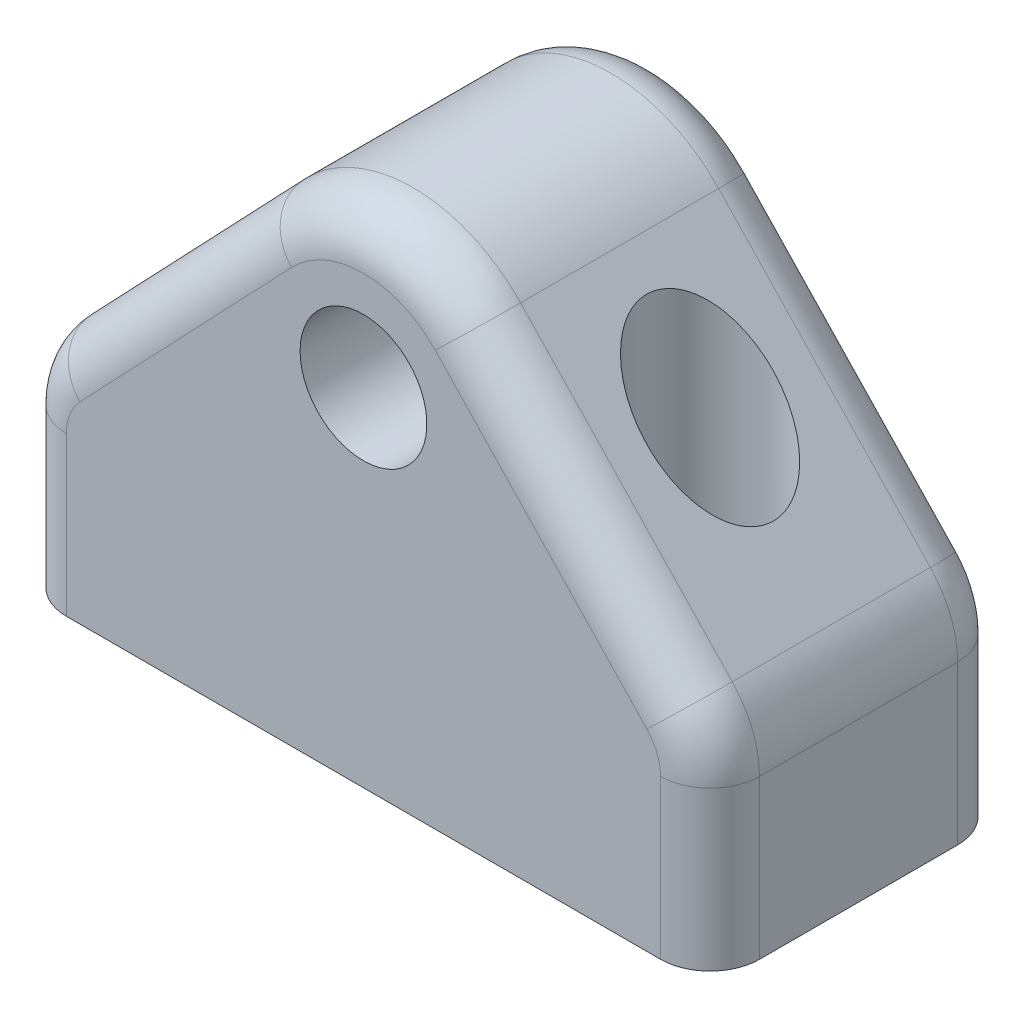
ISO-10303-21;
HEADER;
FILE_DESCRIPTION(('STEP AP214'),'2;1');
FILE_NAME('part.step','',(''),(''),'','','');
FILE_SCHEMA(('AUTOMOTIVE_DESIGN { 1 0 10303 214 1 1 1 1 }'));
ENDSEC;
DATA;
#1=APPLICATION_CONTEXT('core data for automotive mechanical design processes');
#2=APPLICATION_PROTOCOL_DEFINITION('international standard','automotive_design',2000,#1);
#3=PRODUCT_CONTEXT('',#1,'mechanical');
#4=PRODUCT('Part','Part','',(#3));
#5=PRODUCT_RELATED_PRODUCT_CATEGORY('part','',(#4));
#6=PRODUCT_DEFINITION_FORMATION('','',#4);
#7=PRODUCT_DEFINITION_CONTEXT('part definition',#1,'design');
#8=PRODUCT_DEFINITION('design','',#6,#7);
#9=PRODUCT_DEFINITION_SHAPE('','',#8);
#10=(LENGTH_UNIT() NAMED_UNIT(*) SI_UNIT(.MILLI.,.METRE.));
#11=(NAMED_UNIT(*) PLANE_ANGLE_UNIT() SI_UNIT($,.RADIAN.));
#12=(NAMED_UNIT(*) SI_UNIT($,.STERADIAN.) SOLID_ANGLE_UNIT());
#13=UNCERTAINTY_MEASURE_WITH_UNIT(LENGTH_MEASURE(1.E-05),#10,'distance_accuracy_value','');
#14=(GEOMETRIC_REPRESENTATION_CONTEXT(3) GLOBAL_UNCERTAINTY_ASSIGNED_CONTEXT((#13)) GLOBAL_UNIT_ASSIGNED_CONTEXT((#10,
#11,#12)) REPRESENTATION_CONTEXT('',''));
#15=CARTESIAN_POINT('',(0.,0.,0.));
#16=DIRECTION('',(0.,0.,1.));
#17=DIRECTION('',(1.,0.,0.));
#18=AXIS2_PLACEMENT_3D('',#15,#16,#17);
#19=CARTESIAN_POINT('',(3.175,5.08,9.525));
#20=DIRECTION('',(0.,0.,-1.));
#21=DIRECTION('',(-1.,0.,0.));
#22=AXIS2_PLACEMENT_3D('',#19,#20,#21);
#23=PLANE('',#22);
#24=DIRECTION('',(1.,0.,0.));
#25=VECTOR('',#24,1.);
#26=CARTESIAN_POINT('',(22.225,0.,9.525));
#27=LINE('',#26,#25);
#28=CARTESIAN_POINT('',(1.5875,0.,9.525));
#29=VERTEX_POINT('',#28);
#30=CARTESIAN_POINT('',(20.6375,0.,9.525));
#31=VERTEX_POINT('',#30);
#32=EDGE_CURVE('E277',#29,#31,#27,.T.);
#33=ORIENTED_EDGE('',*,*,#32,.T.);
#34=DIRECTION('',(0.,1.,0.));
#35=VECTOR('',#34,1.);
#36=CARTESIAN_POINT('',(20.6375,5.08,9.525));
#37=LINE('',#36,#35);
#38=CARTESIAN_POINT('',(20.6375,5.08,9.525));
#39=VERTEX_POINT('',#38);
#40=EDGE_CURVE('E390',#31,#39,#37,.T.);
#41=ORIENTED_EDGE('',*,*,#40,.T.);
#42=CARTESIAN_POINT('',(19.05,5.08,9.525));
#43=DIRECTION('',(0.,0.,-1.));
#44=DIRECTION('',(-1.,0.,0.));
#45=AXIS2_PLACEMENT_3D('',#42,#43,#44);
#46=CIRCLE('',#45,1.5875);
#47=CARTESIAN_POINT('',(20.1995689655172,6.1748275862069,9.525));
#48=VERTEX_POINT('',#47);
#49=EDGE_CURVE('E70',#39,#48,#46,.F.);
#50=ORIENTED_EDGE('',*,*,#49,.T.);
#51=DIRECTION('',(-0.689655172413793,0.724137931034483,0.));
#52=VECTOR('',#51,1.);
#53=CARTESIAN_POINT('',(12.6490338882283,14.1028894173603,9.525));
#54=LINE('',#53,#52);
#55=CARTESIAN_POINT('',(13.4116379310345,13.3021551724138,9.525));
#56=VERTEX_POINT('',#55);
#57=EDGE_CURVE('E385',#48,#56,#54,.T.);
#58=ORIENTED_EDGE('',*,*,#57,.T.);
#59=CARTESIAN_POINT('',(11.1125,11.1125,9.525));
#60=DIRECTION('',(0.,0.,-1.));
#61=DIRECTION('',(-1.,0.,0.));
#62=AXIS2_PLACEMENT_3D('',#59,#60,#61);
#63=CIRCLE('',#62,3.175);
#64=CARTESIAN_POINT('',(8.81336206896552,13.3021551724138,9.525));
#65=VERTEX_POINT('',#64);
#66=EDGE_CURVE('E373',#56,#65,#63,.F.);
#67=ORIENTED_EDGE('',*,*,#66,.T.);
#68=DIRECTION('',(-0.689655172413793,-0.724137931034483,0.));
#69=VECTOR('',#68,1.);
#70=CARTESIAN_POINT('',(2.02543103448276,6.1748275862069,9.525));
#71=LINE('',#70,#69);
#72=CARTESIAN_POINT('',(2.02543103448276,6.1748275862069,9.525));
#73=VERTEX_POINT('',#72);
#74=EDGE_CURVE('E376',#65,#73,#71,.T.);
#75=ORIENTED_EDGE('',*,*,#74,.T.);
#76=CARTESIAN_POINT('',(3.175,5.08,9.525));
#77=DIRECTION('',(0.,0.,-1.));
#78=DIRECTION('',(-1.,0.,0.));
#79=AXIS2_PLACEMENT_3D('',#76,#77,#78);
#80=CIRCLE('',#79,1.5875);
#81=CARTESIAN_POINT('',(1.5875,5.08,9.525));
#82=VERTEX_POINT('',#81);
#83=EDGE_CURVE('E379',#73,#82,#80,.F.);
#84=ORIENTED_EDGE('',*,*,#83,.T.);
#85=DIRECTION('',(0.,-1.,0.));
#86=VECTOR('',#85,1.);
#87=CARTESIAN_POINT('',(1.5875,5.08,9.525));
#88=LINE('',#87,#86);
#89=EDGE_CURVE('E382',#82,#29,#88,.T.);
#90=ORIENTED_EDGE('',*,*,#89,.T.);
#91=EDGE_LOOP('',(#33,#41,#50,#58,#67,#75,#84,#90));
#92=FACE_BOUND('',#91,.T.);
#93=CARTESIAN_POINT('',(11.1125,11.1125,9.525));
#94=DIRECTION('',(0.,0.,1.));
#95=DIRECTION('',(1.,0.,0.));
#96=AXIS2_PLACEMENT_3D('',#93,#94,#95);
#97=CIRCLE('',#96,2.032);
#98=CARTESIAN_POINT('',(9.0805,11.1125,9.525));
#99=VERTEX_POINT('',#98);
#100=EDGE_CURVE('E267',#99,#99,#97,.T.);
#101=ORIENTED_EDGE('',*,*,#100,.F.);
#102=EDGE_LOOP('',(#101));
#103=FACE_BOUND('',#102,.T.);
#104=ADVANCED_FACE('F45',(#92,#103),#23,.F.);
#105=CARTESIAN_POINT('',(3.175,5.08,0.));
#106=DIRECTION('',(0.,0.,-1.));
#107=DIRECTION('',(-1.,0.,0.));
#108=AXIS2_PLACEMENT_3D('',#105,#106,#107);
#109=PLANE('',#108);
#110=CARTESIAN_POINT('',(19.05,5.08,0.));
#111=DIRECTION('',(0.,0.,-1.));
#112=DIRECTION('',(-1.,0.,0.));
#113=AXIS2_PLACEMENT_3D('',#110,#111,#112);
#114=CIRCLE('',#113,1.5875);
#115=CARTESIAN_POINT('',(20.1995689655172,6.1748275862069,0.));
#116=VERTEX_POINT('',#115);
#117=CARTESIAN_POINT('',(20.6375,5.08,0.));
#118=VERTEX_POINT('',#117);
#119=EDGE_CURVE('E331',#116,#118,#114,.T.);
#120=ORIENTED_EDGE('',*,*,#119,.T.);
#121=DIRECTION('',(0.,1.,0.));
#122=VECTOR('',#121,1.);
#123=CARTESIAN_POINT('',(20.6375,0.,0.));
#124=LINE('',#123,#122);
#125=CARTESIAN_POINT('',(20.6375,0.,0.));
#126=VERTEX_POINT('',#125);
#127=EDGE_CURVE('E334',#118,#126,#124,.F.);
#128=ORIENTED_EDGE('',*,*,#127,.T.);
#129=DIRECTION('',(1.,0.,0.));
#130=VECTOR('',#129,1.);
#131=CARTESIAN_POINT('',(22.225,0.,0.));
#132=LINE('',#131,#130);
#133=CARTESIAN_POINT('',(1.5875,0.,0.));
#134=VERTEX_POINT('',#133);
#135=EDGE_CURVE('E271',#134,#126,#132,.T.);
#136=ORIENTED_EDGE('',*,*,#135,.F.);
#137=DIRECTION('',(0.,-1.,0.));
#138=VECTOR('',#137,1.);
#139=CARTESIAN_POINT('',(1.5875,5.08,0.));
#140=LINE('',#139,#138);
#141=CARTESIAN_POINT('',(1.5875,5.08,0.));
#142=VERTEX_POINT('',#141);
#143=EDGE_CURVE('E325',#134,#142,#140,.F.);
#144=ORIENTED_EDGE('',*,*,#143,.T.);
#145=CARTESIAN_POINT('',(3.175,5.08,0.));
#146=DIRECTION('',(0.,0.,-1.));
#147=DIRECTION('',(-1.,0.,0.));
#148=AXIS2_PLACEMENT_3D('',#145,#146,#147);
#149=CIRCLE('',#148,1.5875);
#150=CARTESIAN_POINT('',(2.02543103448276,6.1748275862069,0.));
#151=VERTEX_POINT('',#150);
#152=EDGE_CURVE('E322',#142,#151,#149,.T.);
#153=ORIENTED_EDGE('',*,*,#152,.T.);
#154=DIRECTION('',(-0.689655172413793,-0.724137931034483,0.));
#155=VECTOR('',#154,1.);
#156=CARTESIAN_POINT('',(8.81336206896552,13.3021551724138,0.));
#157=LINE('',#156,#155);
#158=CARTESIAN_POINT('',(8.81336206896552,13.3021551724138,0.));
#159=VERTEX_POINT('',#158);
#160=EDGE_CURVE('E319',#151,#159,#157,.F.);
#161=ORIENTED_EDGE('',*,*,#160,.T.);
#162=CARTESIAN_POINT('',(11.1125,11.1125,0.));
#163=DIRECTION('',(0.,0.,-1.));
#164=DIRECTION('',(-1.,0.,0.));
#165=AXIS2_PLACEMENT_3D('',#162,#163,#164);
#166=CIRCLE('',#165,3.175);
#167=CARTESIAN_POINT('',(13.4116379310345,13.3021551724138,0.));
#168=VERTEX_POINT('',#167);
#169=EDGE_CURVE('E316',#159,#168,#166,.T.);
#170=ORIENTED_EDGE('',*,*,#169,.T.);
#171=DIRECTION('',(-0.689655172413793,0.724137931034483,0.));
#172=VECTOR('',#171,1.);
#173=CARTESIAN_POINT('',(20.1995689655172,6.1748275862069,0.));
#174=LINE('',#173,#172);
#175=EDGE_CURVE('E328',#168,#116,#174,.F.);
#176=ORIENTED_EDGE('',*,*,#175,.T.);
#177=EDGE_LOOP('',(#120,#128,#136,#144,#153,#161,#170,#176));
#178=FACE_BOUND('',#177,.T.);
#179=CARTESIAN_POINT('',(11.1125,11.1125,0.));
#180=DIRECTION('',(0.,0.,1.));
#181=DIRECTION('',(1.,0.,0.));
#182=AXIS2_PLACEMENT_3D('',#179,#180,#181);
#183=CIRCLE('',#182,2.032);
#184=CARTESIAN_POINT('',(9.0805,11.1125,0.));
#185=VERTEX_POINT('',#184);
#186=EDGE_CURVE('E272',#185,#185,#183,.T.);
#187=ORIENTED_EDGE('',*,*,#186,.T.);
#188=EDGE_LOOP('',(#187));
#189=FACE_BOUND('',#188,.T.);
#190=ADVANCED_FACE('F436',(#178,#189),#109,.T.);
#191=CARTESIAN_POINT('',(22.225,0.,9.525));
#192=DIRECTION('',(0.,1.,0.));
#193=DIRECTION('',(0.,0.,1.));
#194=AXIS2_PLACEMENT_3D('',#191,#192,#193);
#195=PLANE('',#194);
#196=CARTESIAN_POINT('',(4.7625,0.,4.7625));
#197=DIRECTION('',(0.,-1.,0.));
#198=DIRECTION('',(0.,0.,-1.));
#199=AXIS2_PLACEMENT_3D('',#196,#197,#198);
#200=CIRCLE('',#199,2.032);
#201=CARTESIAN_POINT('',(4.7625,0.,2.7305));
#202=VERTEX_POINT('',#201);
#203=EDGE_CURVE('E258',#202,#202,#200,.T.);
#204=ORIENTED_EDGE('',*,*,#203,.F.);
#205=EDGE_LOOP('',(#204));
#206=FACE_BOUND('',#205,.T.);
#207=CARTESIAN_POINT('',(17.4625,0.,4.7625));
#208=DIRECTION('',(0.,-1.,0.));
#209=DIRECTION('',(0.,0.,-1.));
#210=AXIS2_PLACEMENT_3D('',#207,#208,#209);
#211=CIRCLE('',#210,2.032);
#212=CARTESIAN_POINT('',(17.4625,0.,2.7305));
#213=VERTEX_POINT('',#212);
#214=EDGE_CURVE('E251',#213,#213,#211,.T.);
#215=ORIENTED_EDGE('',*,*,#214,.F.);
#216=EDGE_LOOP('',(#215));
#217=FACE_BOUND('',#216,.T.);
#218=ORIENTED_EDGE('',*,*,#135,.T.);
#219=CARTESIAN_POINT('',(20.6375,0.,1.5875));
#220=DIRECTION('',(0.,1.,0.));
#221=DIRECTION('',(0.,0.,1.));
#222=AXIS2_PLACEMENT_3D('',#219,#220,#221);
#223=CIRCLE('',#222,1.5875);
#224=CARTESIAN_POINT('',(22.225,0.,1.5875));
#225=VERTEX_POINT('',#224);
#226=EDGE_CURVE('E174',#126,#225,#223,.F.);
#227=ORIENTED_EDGE('',*,*,#226,.T.);
#228=DIRECTION('',(0.,0.,-1.));
#229=VECTOR('',#228,1.);
#230=CARTESIAN_POINT('',(22.225,0.,9.525));
#231=LINE('',#230,#229);
#232=CARTESIAN_POINT('',(22.225,0.,7.9375));
#233=VERTEX_POINT('',#232);
#234=EDGE_CURVE('E185',#233,#225,#231,.T.);
#235=ORIENTED_EDGE('',*,*,#234,.F.);
#236=CARTESIAN_POINT('',(20.6375,0.,7.9375));
#237=DIRECTION('',(0.,1.,0.));
#238=DIRECTION('',(0.,0.,1.));
#239=AXIS2_PLACEMENT_3D('',#236,#237,#238);
#240=CIRCLE('',#239,1.5875);
#241=EDGE_CURVE('E189',#233,#31,#240,.F.);
#242=ORIENTED_EDGE('',*,*,#241,.T.);
#243=ORIENTED_EDGE('',*,*,#32,.F.);
#244=CARTESIAN_POINT('',(1.5875,0.,7.9375));
#245=DIRECTION('',(0.,1.,0.));
#246=DIRECTION('',(0.,0.,1.));
#247=AXIS2_PLACEMENT_3D('',#244,#245,#246);
#248=CIRCLE('',#247,1.5875);
#249=CARTESIAN_POINT('',(0.,0.,7.9375));
#250=VERTEX_POINT('',#249);
#251=EDGE_CURVE('E337',#29,#250,#248,.F.);
#252=ORIENTED_EDGE('',*,*,#251,.T.);
#253=DIRECTION('',(0.,0.,-1.));
#254=VECTOR('',#253,1.);
#255=CARTESIAN_POINT('',(0.,0.,9.525));
#256=LINE('',#255,#254);
#257=CARTESIAN_POINT('',(0.,0.,1.5875));
#258=VERTEX_POINT('',#257);
#259=EDGE_CURVE('E281',#250,#258,#256,.T.);
#260=ORIENTED_EDGE('',*,*,#259,.T.);
#261=CARTESIAN_POINT('',(1.5875,0.,1.5875));
#262=DIRECTION('',(0.,1.,0.));
#263=DIRECTION('',(0.,0.,1.));
#264=AXIS2_PLACEMENT_3D('',#261,#262,#263);
#265=CIRCLE('',#264,1.5875);
#266=EDGE_CURVE('E342',#258,#134,#265,.F.);
#267=ORIENTED_EDGE('',*,*,#266,.T.);
#268=EDGE_LOOP('',(#218,#227,#235,#242,#243,#252,#260,#267));
#269=FACE_BOUND('',#268,.T.);
#270=ADVANCED_FACE('F424',(#206,#217,#269),#195,.F.);
#271=CARTESIAN_POINT('',(22.225,5.08,9.525));
#272=DIRECTION('',(-1.,0.,0.));
#273=DIRECTION('',(0.,0.,1.));
#274=AXIS2_PLACEMENT_3D('',#271,#272,#273);
#275=PLANE('',#274);
#276=ORIENTED_EDGE('',*,*,#234,.T.);
#277=DIRECTION('',(0.,1.,0.));
#278=VECTOR('',#277,1.);
#279=CARTESIAN_POINT('',(22.225,5.08,1.5875));
#280=LINE('',#279,#278);
#281=CARTESIAN_POINT('',(22.225,5.08,1.5875));
#282=VERTEX_POINT('',#281);
#283=EDGE_CURVE('E183',#225,#282,#280,.T.);
#284=ORIENTED_EDGE('',*,*,#283,.T.);
#285=DIRECTION('',(0.,0.,-1.));
#286=VECTOR('',#285,1.);
#287=CARTESIAN_POINT('',(22.225,5.08,9.525));
#288=LINE('',#287,#286);
#289=CARTESIAN_POINT('',(22.225,5.08,7.9375));
#290=VERTEX_POINT('',#289);
#291=EDGE_CURVE('E166',#290,#282,#288,.T.);
#292=ORIENTED_EDGE('',*,*,#291,.F.);
#293=DIRECTION('',(0.,1.,0.));
#294=VECTOR('',#293,1.);
#295=CARTESIAN_POINT('',(22.225,5.08,7.9375));
#296=LINE('',#295,#294);
#297=EDGE_CURVE('E180',#290,#233,#296,.F.);
#298=ORIENTED_EDGE('',*,*,#297,.T.);
#299=EDGE_LOOP('',(#276,#284,#292,#298));
#300=FACE_BOUND('',#299,.T.);
#301=ADVANCED_FACE('F179',(#300),#275,.F.);
#302=CARTESIAN_POINT('',(19.05,5.08,9.525));
#303=DIRECTION('',(0.,0.,-1.));
#304=DIRECTION('',(-1.,0.,0.));
#305=AXIS2_PLACEMENT_3D('',#302,#303,#304);
#306=CYLINDRICAL_SURFACE('',#305,3.175);
#307=ORIENTED_EDGE('',*,*,#291,.T.);
#308=CARTESIAN_POINT('',(19.05,5.08,1.5875));
#309=DIRECTION('',(0.,0.,-1.));
#310=DIRECTION('',(-1.,0.,0.));
#311=AXIS2_PLACEMENT_3D('',#308,#309,#310);
#312=CIRCLE('',#311,3.175);
#313=CARTESIAN_POINT('',(21.3491379310345,7.26965517241379,1.5875));
#314=VERTEX_POINT('',#313);
#315=EDGE_CURVE('E173',#282,#314,#312,.F.);
#316=ORIENTED_EDGE('',*,*,#315,.T.);
#317=DIRECTION('',(0.,0.,-1.));
#318=VECTOR('',#317,1.);
#319=CARTESIAN_POINT('',(21.3491379310345,7.26965517241379,9.525));
#320=LINE('',#319,#318);
#321=CARTESIAN_POINT('',(21.3491379310345,7.26965517241379,7.9375));
#322=VERTEX_POINT('',#321);
#323=EDGE_CURVE('E168',#322,#314,#320,.T.);
#324=ORIENTED_EDGE('',*,*,#323,.F.);
#325=CARTESIAN_POINT('',(19.05,5.08,7.9375));
#326=DIRECTION('',(0.,0.,-1.));
#327=DIRECTION('',(-1.,0.,0.));
#328=AXIS2_PLACEMENT_3D('',#325,#326,#327);
#329=CIRCLE('',#328,3.175);
#330=EDGE_CURVE('E163',#322,#290,#329,.T.);
#331=ORIENTED_EDGE('',*,*,#330,.T.);
#332=EDGE_LOOP('',(#307,#316,#324,#331));
#333=FACE_BOUND('',#332,.T.);
#334=ADVANCED_FACE('F165',(#333),#306,.T.);
#335=CARTESIAN_POINT('',(14.5612068965517,14.3969827586207,9.525));
#336=DIRECTION('',(-0.724137931034483,-0.689655172413793,0.));
#337=DIRECTION('',(0.689655172413793,-0.724137931034483,0.));
#338=AXIS2_PLACEMENT_3D('',#335,#336,#337);
#339=PLANE('',#338);
#340=CARTESIAN_POINT('',(17.4625,11.350625,4.7625));
#341=DIRECTION('',(-0.724137931034483,-0.689655172413793,0.));
#342=DIRECTION('',(0.689655172413793,-0.724137931034483,0.));
#343=AXIS2_PLACEMENT_3D('',#340,#341,#342);
#344=ELLIPSE('',#343,2.9464,2.032);
#345=CARTESIAN_POINT('',(19.4945,9.217025,4.7625));
#346=VERTEX_POINT('',#345);
#347=EDGE_CURVE('E276',#346,#346,#344,.T.);
#348=ORIENTED_EDGE('',*,*,#347,.T.);
#349=EDGE_LOOP('',(#348));
#350=FACE_BOUND('',#349,.T.);
#351=ORIENTED_EDGE('',*,*,#323,.T.);
#352=DIRECTION('',(-0.689655172413793,0.724137931034483,0.));
#353=VECTOR('',#352,1.);
#354=CARTESIAN_POINT('',(14.5612068965517,14.3969827586207,1.5875));
#355=LINE('',#354,#353);
#356=CARTESIAN_POINT('',(14.5612068965517,14.3969827586207,1.5875));
#357=VERTEX_POINT('',#356);
#358=EDGE_CURVE('E352',#314,#357,#355,.T.);
#359=ORIENTED_EDGE('',*,*,#358,.T.);
#360=DIRECTION('',(0.,0.,-1.));
#361=VECTOR('',#360,1.);
#362=CARTESIAN_POINT('',(14.5612068965517,14.3969827586207,9.525));
#363=LINE('',#362,#361);
#364=CARTESIAN_POINT('',(14.5612068965517,14.3969827586207,7.9375));
#365=VERTEX_POINT('',#364);
#366=EDGE_CURVE('E300',#365,#357,#363,.T.);
#367=ORIENTED_EDGE('',*,*,#366,.F.);
#368=DIRECTION('',(-0.689655172413793,0.724137931034483,0.));
#369=VECTOR('',#368,1.);
#370=CARTESIAN_POINT('',(14.5612068965517,14.3969827586207,7.9375));
#371=LINE('',#370,#369);
#372=EDGE_CURVE('E349',#365,#322,#371,.F.);
#373=ORIENTED_EDGE('',*,*,#372,.T.);
#374=EDGE_LOOP('',(#351,#359,#367,#373));
#375=FACE_BOUND('',#374,.T.);
#376=ADVANCED_FACE('F403',(#350,#375),#339,.F.);
#377=CARTESIAN_POINT('',(11.1125,11.1125,9.525));
#378=DIRECTION('',(0.,0.,-1.));
#379=DIRECTION('',(-1.,0.,0.));
#380=AXIS2_PLACEMENT_3D('',#377,#378,#379);
#381=CYLINDRICAL_SURFACE('',#380,4.7625);
#382=ORIENTED_EDGE('',*,*,#366,.T.);
#383=CARTESIAN_POINT('',(11.1125,11.1125,1.5875));
#384=DIRECTION('',(0.,0.,-1.));
#385=DIRECTION('',(-1.,0.,0.));
#386=AXIS2_PLACEMENT_3D('',#383,#384,#385);
#387=CIRCLE('',#386,4.7625);
#388=CARTESIAN_POINT('',(7.66379310344827,14.3969827586207,1.5875));
#389=VERTEX_POINT('',#388);
#390=EDGE_CURVE('E11',#357,#389,#387,.F.);
#391=ORIENTED_EDGE('',*,*,#390,.T.);
#392=DIRECTION('',(0.,0.,-1.));
#393=VECTOR('',#392,1.);
#394=CARTESIAN_POINT('',(7.66379310344827,14.3969827586207,9.525));
#395=LINE('',#394,#393);
#396=CARTESIAN_POINT('',(7.66379310344827,14.3969827586207,7.9375));
#397=VERTEX_POINT('',#396);
#398=EDGE_CURVE('E296',#397,#389,#395,.T.);
#399=ORIENTED_EDGE('',*,*,#398,.F.);
#400=CARTESIAN_POINT('',(11.1125,11.1125,7.9375));
#401=DIRECTION('',(0.,0.,-1.));
#402=DIRECTION('',(-1.,0.,0.));
#403=AXIS2_PLACEMENT_3D('',#400,#401,#402);
#404=CIRCLE('',#403,4.7625);
#405=EDGE_CURVE('E55',#397,#365,#404,.T.);
#406=ORIENTED_EDGE('',*,*,#405,.T.);
#407=EDGE_LOOP('',(#382,#391,#399,#406));
#408=FACE_BOUND('',#407,.T.);
#409=ADVANCED_FACE('F397',(#408),#381,.T.);
#410=CARTESIAN_POINT('',(0.875862068965517,7.26965517241379,9.525));
#411=DIRECTION('',(0.724137931034483,-0.689655172413793,0.));
#412=DIRECTION('',(0.689655172413793,0.724137931034483,0.));
#413=AXIS2_PLACEMENT_3D('',#410,#411,#412);
#414=PLANE('',#413);
#415=CARTESIAN_POINT('',(4.7625,11.350625,4.7625));
#416=DIRECTION('',(0.724137931034483,-0.689655172413793,0.));
#417=DIRECTION('',(-0.689655172413793,-0.724137931034483,0.));
#418=AXIS2_PLACEMENT_3D('',#415,#416,#417);
#419=ELLIPSE('',#418,2.9464,2.032);
#420=CARTESIAN_POINT('',(2.7305,9.217025,4.7625));
#421=VERTEX_POINT('',#420);
#422=EDGE_CURVE('E264',#421,#421,#419,.T.);
#423=ORIENTED_EDGE('',*,*,#422,.T.);
#424=EDGE_LOOP('',(#423));
#425=FACE_BOUND('',#424,.T.);
#426=ORIENTED_EDGE('',*,*,#398,.T.);
#427=DIRECTION('',(-0.689655172413793,-0.724137931034483,0.));
#428=VECTOR('',#427,1.);
#429=CARTESIAN_POINT('',(0.875862068965517,7.26965517241379,1.5875));
#430=LINE('',#429,#428);
#431=CARTESIAN_POINT('',(0.875862068965517,7.26965517241379,1.5875));
#432=VERTEX_POINT('',#431);
#433=EDGE_CURVE('E370',#389,#432,#430,.T.);
#434=ORIENTED_EDGE('',*,*,#433,.T.);
#435=DIRECTION('',(0.,0.,-1.));
#436=VECTOR('',#435,1.);
#437=CARTESIAN_POINT('',(0.875862068965517,7.26965517241379,9.525));
#438=LINE('',#437,#436);
#439=CARTESIAN_POINT('',(0.875862068965517,7.26965517241379,7.9375));
#440=VERTEX_POINT('',#439);
#441=EDGE_CURVE('E292',#440,#432,#438,.T.);
#442=ORIENTED_EDGE('',*,*,#441,.F.);
#443=DIRECTION('',(-0.689655172413793,-0.724137931034483,0.));
#444=VECTOR('',#443,1.);
#445=CARTESIAN_POINT('',(0.875862068965517,7.26965517241379,7.9375));
#446=LINE('',#445,#444);
#447=EDGE_CURVE('E367',#440,#397,#446,.F.);
#448=ORIENTED_EDGE('',*,*,#447,.T.);
#449=EDGE_LOOP('',(#426,#434,#442,#448));
#450=FACE_BOUND('',#449,.T.);
#451=ADVANCED_FACE('F414',(#425,#450),#414,.F.);
#452=CARTESIAN_POINT('',(3.175,5.08,9.525));
#453=DIRECTION('',(0.,0.,-1.));
#454=DIRECTION('',(-1.,0.,0.));
#455=AXIS2_PLACEMENT_3D('',#452,#453,#454);
#456=CYLINDRICAL_SURFACE('',#455,3.175);
#457=ORIENTED_EDGE('',*,*,#441,.T.);
#458=CARTESIAN_POINT('',(3.175,5.08,1.5875));
#459=DIRECTION('',(0.,0.,-1.));
#460=DIRECTION('',(-1.,0.,0.));
#461=AXIS2_PLACEMENT_3D('',#458,#459,#460);
#462=CIRCLE('',#461,3.175);
#463=CARTESIAN_POINT('',(0.,5.08,1.5875));
#464=VERTEX_POINT('',#463);
#465=EDGE_CURVE('E364',#432,#464,#462,.F.);
#466=ORIENTED_EDGE('',*,*,#465,.T.);
#467=DIRECTION('',(0.,0.,-1.));
#468=VECTOR('',#467,1.);
#469=CARTESIAN_POINT('',(0.,5.08,9.525));
#470=LINE('',#469,#468);
#471=CARTESIAN_POINT('',(0.,5.08,7.9375));
#472=VERTEX_POINT('',#471);
#473=EDGE_CURVE('E288',#472,#464,#470,.T.);
#474=ORIENTED_EDGE('',*,*,#473,.F.);
#475=CARTESIAN_POINT('',(3.175,5.08,7.9375));
#476=DIRECTION('',(0.,0.,-1.));
#477=DIRECTION('',(-1.,0.,0.));
#478=AXIS2_PLACEMENT_3D('',#475,#476,#477);
#479=CIRCLE('',#478,3.175);
#480=EDGE_CURVE('E361',#472,#440,#479,.T.);
#481=ORIENTED_EDGE('',*,*,#480,.T.);
#482=EDGE_LOOP('',(#457,#466,#474,#481));
#483=FACE_BOUND('',#482,.T.);
#484=ADVANCED_FACE('F453',(#483),#456,.T.);
#485=CARTESIAN_POINT('',(0.,0.,9.525));
#486=DIRECTION('',(1.,0.,0.));
#487=DIRECTION('',(0.,0.,-1.));
#488=AXIS2_PLACEMENT_3D('',#485,#486,#487);
#489=PLANE('',#488);
#490=ORIENTED_EDGE('',*,*,#473,.T.);
#491=DIRECTION('',(0.,-1.,0.));
#492=VECTOR('',#491,1.);
#493=CARTESIAN_POINT('',(0.,0.,1.5875));
#494=LINE('',#493,#492);
#495=EDGE_CURVE('E358',#464,#258,#494,.T.);
#496=ORIENTED_EDGE('',*,*,#495,.T.);
#497=ORIENTED_EDGE('',*,*,#259,.F.);
#498=DIRECTION('',(0.,-1.,0.));
#499=VECTOR('',#498,1.);
#500=CARTESIAN_POINT('',(0.,0.,7.9375));
#501=LINE('',#500,#499);
#502=EDGE_CURVE('E355',#250,#472,#501,.F.);
#503=ORIENTED_EDGE('',*,*,#502,.T.);
#504=EDGE_LOOP('',(#490,#496,#497,#503));
#505=FACE_BOUND('',#504,.T.);
#506=ADVANCED_FACE('F427',(#505),#489,.F.);
#507=CARTESIAN_POINT('',(11.1125,11.1125,9.525));
#508=DIRECTION('',(0.,0.,-1.));
#509=DIRECTION('',(-1.,0.,0.));
#510=AXIS2_PLACEMENT_3D('',#507,#508,#509);
#511=CYLINDRICAL_SURFACE('',#510,2.032);
#512=CARTESIAN_POINT('',(9.0805,11.1125,9.525));
#513=CARTESIAN_POINT('',(9.0805,11.1125,9.42578125));
#514=CARTESIAN_POINT('',(9.0805,11.1125,9.3265625));
#515=CARTESIAN_POINT('',(9.0805,11.1125,9.128125));
#516=CARTESIAN_POINT('',(9.0805,11.1125,9.02890625));
#517=CARTESIAN_POINT('',(9.0805,11.1125,8.83046875));
#518=CARTESIAN_POINT('',(9.0805,11.1125,8.73125));
#519=CARTESIAN_POINT('',(9.0805,11.1125,8.5328125));
#520=CARTESIAN_POINT('',(9.0805,11.1125,8.43359375));
#521=CARTESIAN_POINT('',(9.0805,11.1125,8.23515625));
#522=CARTESIAN_POINT('',(9.0805,11.1125,8.1359375));
#523=CARTESIAN_POINT('',(9.0805,11.1125,7.9375));
#524=CARTESIAN_POINT('',(9.0805,11.1125,7.83828125));
#525=CARTESIAN_POINT('',(9.0805,11.1125,7.63984375));
#526=CARTESIAN_POINT('',(9.0805,11.1125,7.540625));
#527=CARTESIAN_POINT('',(9.0805,11.1125,7.3421875));
#528=CARTESIAN_POINT('',(9.0805,11.1125,7.24296875));
#529=CARTESIAN_POINT('',(9.0805,11.1125,7.04453125));
#530=CARTESIAN_POINT('',(9.0805,11.1125,6.9453125));
#531=CARTESIAN_POINT('',(9.0805,11.1125,6.746875));
#532=CARTESIAN_POINT('',(9.0805,11.1125,6.64765625));
#533=CARTESIAN_POINT('',(9.0805,11.1125,6.44921875));
#534=CARTESIAN_POINT('',(9.0805,11.1125,6.35));
#535=CARTESIAN_POINT('',(9.0805,11.1125,6.1515625));
#536=CARTESIAN_POINT('',(9.0805,11.1125,6.05234375));
#537=CARTESIAN_POINT('',(9.0805,11.1125,5.85390625));
#538=CARTESIAN_POINT('',(9.0805,11.1125,5.7546875));
#539=CARTESIAN_POINT('',(9.0805,11.1125,5.55625));
#540=CARTESIAN_POINT('',(9.0805,11.1125,5.45703125));
#541=CARTESIAN_POINT('',(9.0805,11.1125,5.25859375));
#542=CARTESIAN_POINT('',(9.0805,11.1125,5.159375));
#543=CARTESIAN_POINT('',(9.0805,11.1125,4.9609375));
#544=CARTESIAN_POINT('',(9.0805,11.1125,4.86171875));
#545=CARTESIAN_POINT('',(9.0805,11.1125,4.66328125));
#546=CARTESIAN_POINT('',(9.0805,11.1125,4.5640625));
#547=CARTESIAN_POINT('',(9.0805,11.1125,4.365625));
#548=CARTESIAN_POINT('',(9.0805,11.1125,4.26640625));
#549=CARTESIAN_POINT('',(9.0805,11.1125,4.06796875));
#550=CARTESIAN_POINT('',(9.0805,11.1125,3.96875));
#551=CARTESIAN_POINT('',(9.0805,11.1125,3.7703125));
#552=CARTESIAN_POINT('',(9.0805,11.1125,3.67109375));
#553=CARTESIAN_POINT('',(9.0805,11.1125,3.47265625));
#554=CARTESIAN_POINT('',(9.0805,11.1125,3.3734375));
#555=CARTESIAN_POINT('',(9.0805,11.1125,3.175));
#556=CARTESIAN_POINT('',(9.0805,11.1125,3.07578125));
#557=CARTESIAN_POINT('',(9.0805,11.1125,2.87734375));
#558=CARTESIAN_POINT('',(9.0805,11.1125,2.778125));
#559=CARTESIAN_POINT('',(9.0805,11.1125,2.5796875));
#560=CARTESIAN_POINT('',(9.0805,11.1125,2.48046875));
#561=CARTESIAN_POINT('',(9.0805,11.1125,2.28203125));
#562=CARTESIAN_POINT('',(9.0805,11.1125,2.1828125));
#563=CARTESIAN_POINT('',(9.0805,11.1125,1.984375));
#564=CARTESIAN_POINT('',(9.0805,11.1125,1.88515625));
#565=CARTESIAN_POINT('',(9.0805,11.1125,1.68671875));
#566=CARTESIAN_POINT('',(9.0805,11.1125,1.5875));
#567=CARTESIAN_POINT('',(9.0805,11.1125,1.3890625));
#568=CARTESIAN_POINT('',(9.0805,11.1125,1.28984375));
#569=CARTESIAN_POINT('',(9.0805,11.1125,1.09140625));
#570=CARTESIAN_POINT('',(9.0805,11.1125,0.992187500000001));
#571=CARTESIAN_POINT('',(9.0805,11.1125,0.793750000000001));
#572=CARTESIAN_POINT('',(9.0805,11.1125,0.69453125));
#573=CARTESIAN_POINT('',(9.0805,11.1125,0.49609375));
#574=CARTESIAN_POINT('',(9.0805,11.1125,0.396875));
#575=CARTESIAN_POINT('',(9.0805,11.1125,0.1984375));
#576=CARTESIAN_POINT('',(9.0805,11.1125,0.0992187500000001));
#577=CARTESIAN_POINT('',(9.0805,11.1125,0.));
#578=B_SPLINE_CURVE_WITH_KNOTS('',3,(#512,#513,#514,#515,#516,#517,#518,#519,#520,#521,#522,
#523,#524,#525,#526,#527,#528,#529,#530,#531,#532,#533,#534,#535,#536,#537,#538,#539,#540,#541,
#542,#543,#544,#545,#546,#547,#548,#549,#550,#551,#552,#553,#554,#555,#556,#557,#558,#559,#560,
#561,#562,#563,#564,#565,#566,#567,#568,#569,#570,#571,#572,#573,#574,#575,#576,#577),
.UNSPECIFIED.,.F.,.F.,(4,2,2,2,2,2,2,2,2,2,2,2,2,2,2,2,2,2,2,2,2,2,2,2,2,2,2,2,2,2,2,2,4),(0.,
0.29765625,0.5953125,0.892968750000001,1.190625,1.48828125,1.7859375,2.08359375,2.38125,
2.67890625,2.9765625,3.27421875,3.571875,3.86953125,4.1671875,4.46484375,4.7625,5.06015625,
5.3578125,5.65546875,5.953125,6.25078125,6.5484375,6.84609375,7.14375,7.44140625,7.7390625,
8.03671875,8.334375,8.63203125,8.9296875,9.22734375,9.525),.UNSPECIFIED.);
#579=EDGE_CURVE('BSEAM460',#99,#185,#578,.T.);
#580=ORIENTED_EDGE('',*,*,#100,.T.);
#581=ORIENTED_EDGE('',*,*,#186,.F.);
#582=ORIENTED_EDGE('',*,*,#579,.T.);
#583=ORIENTED_EDGE('',*,*,#579,.F.);
#584=EDGE_LOOP('',(#580,#582,#581,#583));
#585=FACE_BOUND('',#584,.T.);
#586=ADVANCED_FACE('F460',(#585),#511,.F.);
#587=CARTESIAN_POINT('',(4.7625,15.875,4.7625));
#588=DIRECTION('',(0.,-1.,0.));
#589=DIRECTION('',(0.,0.,-1.));
#590=AXIS2_PLACEMENT_3D('',#587,#588,#589);
#591=CYLINDRICAL_SURFACE('',#590,2.032);
#592=ORIENTED_EDGE('',*,*,#203,.T.);
#593=EDGE_LOOP('',(#592));
#594=FACE_BOUND('',#593,.T.);
#595=ORIENTED_EDGE('',*,*,#422,.F.);
#596=EDGE_LOOP('',(#595));
#597=FACE_BOUND('',#596,.T.);
#598=ADVANCED_FACE('F474',(#594,#597),#591,.F.);
#599=CARTESIAN_POINT('',(17.4625,15.875,4.7625));
#600=DIRECTION('',(0.,-1.,0.));
#601=DIRECTION('',(0.,0.,-1.));
#602=AXIS2_PLACEMENT_3D('',#599,#600,#601);
#603=CYLINDRICAL_SURFACE('',#602,2.032);
#604=ORIENTED_EDGE('',*,*,#214,.T.);
#605=EDGE_LOOP('',(#604));
#606=FACE_BOUND('',#605,.T.);
#607=ORIENTED_EDGE('',*,*,#347,.F.);
#608=EDGE_LOOP('',(#607));
#609=FACE_BOUND('',#608,.T.);
#610=ADVANCED_FACE('F476',(#606,#609),#603,.F.);
#611=CARTESIAN_POINT('',(1.5875,0.,1.5875));
#612=DIRECTION('',(0.,1.,0.));
#613=DIRECTION('',(0.,0.,1.));
#614=AXIS2_PLACEMENT_3D('',#611,#612,#613);
#615=CYLINDRICAL_SURFACE('',#614,1.5875);
#616=ORIENTED_EDGE('',*,*,#266,.F.);
#617=ORIENTED_EDGE('',*,*,#495,.F.);
#618=CARTESIAN_POINT('',(1.5875,5.08,1.5875));
#619=DIRECTION('',(0.,1.,0.));
#620=DIRECTION('',(0.,0.,1.));
#621=AXIS2_PLACEMENT_3D('',#618,#619,#620);
#622=CIRCLE('',#621,1.5875);
#623=EDGE_CURVE('E200',#142,#464,#622,.T.);
#624=ORIENTED_EDGE('',*,*,#623,.F.);
#625=ORIENTED_EDGE('',*,*,#143,.F.);
#626=EDGE_LOOP('',(#616,#617,#624,#625));
#627=FACE_BOUND('',#626,.T.);
#628=ADVANCED_FACE('F431',(#627),#615,.T.);
#629=CARTESIAN_POINT('',(3.175,5.08,1.5875));
#630=DIRECTION('',(0.,0.,-1.));
#631=DIRECTION('',(-1.,0.,0.));
#632=AXIS2_PLACEMENT_3D('',#629,#630,#631);
#633=DEGENERATE_TOROIDAL_SURFACE('',#632,1.5875,1.5875,.T.);
#634=ORIENTED_EDGE('',*,*,#623,.T.);
#635=ORIENTED_EDGE('',*,*,#465,.F.);
#636=CARTESIAN_POINT('',(2.02543103448276,6.1748275862069,1.5875));
#637=DIRECTION('',(0.689655172413793,0.724137931034483,0.));
#638=DIRECTION('',(-0.724137931034483,0.689655172413793,0.));
#639=AXIS2_PLACEMENT_3D('',#636,#637,#638);
#640=CIRCLE('',#639,1.5875);
#641=EDGE_CURVE('E242',#151,#432,#640,.T.);
#642=ORIENTED_EDGE('',*,*,#641,.F.);
#643=ORIENTED_EDGE('',*,*,#152,.F.);
#644=EDGE_LOOP('',(#634,#635,#642,#643));
#645=FACE_BOUND('',#644,.T.);
#646=ADVANCED_FACE('F452',(#645),#633,.T.);
#647=CARTESIAN_POINT('',(2.02543103448276,6.1748275862069,1.5875));
#648=DIRECTION('',(0.689655172413793,0.724137931034483,0.));
#649=DIRECTION('',(-0.724137931034483,0.689655172413793,0.));
#650=AXIS2_PLACEMENT_3D('',#647,#648,#649);
#651=CYLINDRICAL_SURFACE('',#650,1.5875);
#652=ORIENTED_EDGE('',*,*,#641,.T.);
#653=ORIENTED_EDGE('',*,*,#433,.F.);
#654=CARTESIAN_POINT('',(8.81336206896552,13.3021551724138,1.5875));
#655=DIRECTION('',(0.689655172413793,0.724137931034483,0.));
#656=DIRECTION('',(-0.724137931034483,0.689655172413793,0.));
#657=AXIS2_PLACEMENT_3D('',#654,#655,#656);
#658=CIRCLE('',#657,1.5875);
#659=EDGE_CURVE('E239',#159,#389,#658,.T.);
#660=ORIENTED_EDGE('',*,*,#659,.F.);
#661=ORIENTED_EDGE('',*,*,#160,.F.);
#662=EDGE_LOOP('',(#652,#653,#660,#661));
#663=FACE_BOUND('',#662,.T.);
#664=ADVANCED_FACE('F451',(#663),#651,.T.);
#665=CARTESIAN_POINT('',(11.1125,11.1125,1.5875));
#666=DIRECTION('',(0.,0.,-1.));
#667=DIRECTION('',(-1.,0.,0.));
#668=AXIS2_PLACEMENT_3D('',#665,#666,#667);
#669=TOROIDAL_SURFACE('',#668,3.175,1.5875);
#670=ORIENTED_EDGE('',*,*,#659,.T.);
#671=ORIENTED_EDGE('',*,*,#390,.F.);
#672=CARTESIAN_POINT('',(13.4116379310345,13.3021551724138,1.5875));
#673=DIRECTION('',(0.689655172413793,-0.724137931034482,0.));
#674=DIRECTION('',(0.724137931034483,0.689655172413793,0.));
#675=AXIS2_PLACEMENT_3D('',#672,#673,#674);
#676=CIRCLE('',#675,1.5875);
#677=EDGE_CURVE('E232',#168,#357,#676,.T.);
#678=ORIENTED_EDGE('',*,*,#677,.F.);
#679=ORIENTED_EDGE('',*,*,#169,.F.);
#680=EDGE_LOOP('',(#670,#671,#678,#679));
#681=FACE_BOUND('',#680,.T.);
#682=ADVANCED_FACE('F449',(#681),#669,.T.);
#683=CARTESIAN_POINT('',(13.4116379310345,13.3021551724138,1.5875));
#684=DIRECTION('',(0.689655172413793,-0.724137931034483,0.));
#685=DIRECTION('',(0.724137931034483,0.689655172413793,0.));
#686=AXIS2_PLACEMENT_3D('',#683,#684,#685);
#687=CYLINDRICAL_SURFACE('',#686,1.5875);
#688=ORIENTED_EDGE('',*,*,#677,.T.);
#689=ORIENTED_EDGE('',*,*,#358,.F.);
#690=CARTESIAN_POINT('',(20.1995689655172,6.1748275862069,1.5875));
#691=DIRECTION('',(0.689655172413792,-0.724137931034484,0.));
#692=DIRECTION('',(0.724137931034484,0.689655172413792,0.));
#693=AXIS2_PLACEMENT_3D('',#690,#691,#692);
#694=CIRCLE('',#693,1.5875);
#695=EDGE_CURVE('E224',#116,#314,#694,.T.);
#696=ORIENTED_EDGE('',*,*,#695,.F.);
#697=ORIENTED_EDGE('',*,*,#175,.F.);
#698=EDGE_LOOP('',(#688,#689,#696,#697));
#699=FACE_BOUND('',#698,.T.);
#700=ADVANCED_FACE('F444',(#699),#687,.T.);
#701=CARTESIAN_POINT('',(19.05,5.08,1.5875));
#702=DIRECTION('',(0.,0.,-1.));
#703=DIRECTION('',(-1.,0.,0.));
#704=AXIS2_PLACEMENT_3D('',#701,#702,#703);
#705=TOROIDAL_SURFACE('',#704,1.5875,1.5875);
#706=ORIENTED_EDGE('',*,*,#695,.T.);
#707=ORIENTED_EDGE('',*,*,#315,.F.);
#708=CARTESIAN_POINT('',(20.6375,5.08,1.5875));
#709=DIRECTION('',(0.,-1.,0.));
#710=DIRECTION('',(0.,0.,-1.));
#711=AXIS2_PLACEMENT_3D('',#708,#709,#710);
#712=CIRCLE('',#711,1.5875);
#713=EDGE_CURVE('E218',#118,#282,#712,.T.);
#714=ORIENTED_EDGE('',*,*,#713,.F.);
#715=ORIENTED_EDGE('',*,*,#119,.F.);
#716=EDGE_LOOP('',(#706,#707,#714,#715));
#717=FACE_BOUND('',#716,.T.);
#718=ADVANCED_FACE('F441',(#717),#705,.T.);
#719=CARTESIAN_POINT('',(20.6375,5.08,1.5875));
#720=DIRECTION('',(0.,-1.,0.));
#721=DIRECTION('',(0.,0.,-1.));
#722=AXIS2_PLACEMENT_3D('',#719,#720,#721);
#723=CYLINDRICAL_SURFACE('',#722,1.5875);
#724=ORIENTED_EDGE('',*,*,#226,.F.);
#725=ORIENTED_EDGE('',*,*,#127,.F.);
#726=ORIENTED_EDGE('',*,*,#713,.T.);
#727=ORIENTED_EDGE('',*,*,#283,.F.);
#728=EDGE_LOOP('',(#724,#725,#726,#727));
#729=FACE_BOUND('',#728,.T.);
#730=ADVANCED_FACE('F439',(#729),#723,.T.);
#731=CARTESIAN_POINT('',(1.5875,5.08,7.9375));
#732=DIRECTION('',(0.,-1.,0.));
#733=DIRECTION('',(0.,0.,-1.));
#734=AXIS2_PLACEMENT_3D('',#731,#732,#733);
#735=CYLINDRICAL_SURFACE('',#734,1.5875);
#736=ORIENTED_EDGE('',*,*,#251,.F.);
#737=ORIENTED_EDGE('',*,*,#89,.F.);
#738=CARTESIAN_POINT('',(1.5875,5.08,7.9375));
#739=DIRECTION('',(0.,1.,0.));
#740=DIRECTION('',(0.,0.,1.));
#741=AXIS2_PLACEMENT_3D('',#738,#739,#740);
#742=CIRCLE('',#741,1.5875);
#743=EDGE_CURVE('E49',#472,#82,#742,.T.);
#744=ORIENTED_EDGE('',*,*,#743,.F.);
#745=ORIENTED_EDGE('',*,*,#502,.F.);
#746=EDGE_LOOP('',(#736,#737,#744,#745));
#747=FACE_BOUND('',#746,.T.);
#748=ADVANCED_FACE('F47',(#747),#735,.T.);
#749=CARTESIAN_POINT('',(3.175,5.08,7.9375));
#750=DIRECTION('',(0.,0.,-1.));
#751=DIRECTION('',(-1.,0.,0.));
#752=AXIS2_PLACEMENT_3D('',#749,#750,#751);
#753=DEGENERATE_TOROIDAL_SURFACE('',#752,1.5875,1.5875,.T.);
#754=ORIENTED_EDGE('',*,*,#743,.T.);
#755=ORIENTED_EDGE('',*,*,#83,.F.);
#756=CARTESIAN_POINT('',(2.02543103448276,6.1748275862069,7.9375));
#757=DIRECTION('',(0.689655172413793,0.724137931034483,0.));
#758=DIRECTION('',(-0.724137931034483,0.689655172413793,0.));
#759=AXIS2_PLACEMENT_3D('',#756,#757,#758);
#760=CIRCLE('',#759,1.5875);
#761=EDGE_CURVE('E209',#440,#73,#760,.T.);
#762=ORIENTED_EDGE('',*,*,#761,.F.);
#763=ORIENTED_EDGE('',*,*,#480,.F.);
#764=EDGE_LOOP('',(#754,#755,#762,#763));
#765=FACE_BOUND('',#764,.T.);
#766=ADVANCED_FACE('F416',(#765),#753,.T.);
#767=CARTESIAN_POINT('',(2.02543103448276,6.1748275862069,7.9375));
#768=DIRECTION('',(-0.689655172413793,-0.724137931034483,0.));
#769=DIRECTION('',(0.724137931034483,-0.689655172413793,0.));
#770=AXIS2_PLACEMENT_3D('',#767,#768,#769);
#771=CYLINDRICAL_SURFACE('',#770,1.5875);
#772=ORIENTED_EDGE('',*,*,#761,.T.);
#773=ORIENTED_EDGE('',*,*,#74,.F.);
#774=CARTESIAN_POINT('',(8.81336206896552,13.3021551724138,7.9375));
#775=DIRECTION('',(0.689655172413793,0.724137931034483,0.));
#776=DIRECTION('',(-0.724137931034483,0.689655172413793,0.));
#777=AXIS2_PLACEMENT_3D('',#774,#775,#776);
#778=CIRCLE('',#777,1.5875);
#779=EDGE_CURVE('E206',#397,#65,#778,.T.);
#780=ORIENTED_EDGE('',*,*,#779,.F.);
#781=ORIENTED_EDGE('',*,*,#447,.F.);
#782=EDGE_LOOP('',(#772,#773,#780,#781));
#783=FACE_BOUND('',#782,.T.);
#784=ADVANCED_FACE('F411',(#783),#771,.T.);
#785=CARTESIAN_POINT('',(11.1125,11.1125,7.9375));
#786=DIRECTION('',(0.,0.,-1.));
#787=DIRECTION('',(-1.,0.,0.));
#788=AXIS2_PLACEMENT_3D('',#785,#786,#787);
#789=TOROIDAL_SURFACE('',#788,3.175,1.5875);
#790=ORIENTED_EDGE('',*,*,#779,.T.);
#791=ORIENTED_EDGE('',*,*,#66,.F.);
#792=CARTESIAN_POINT('',(13.4116379310345,13.3021551724138,7.9375));
#793=DIRECTION('',(0.689655172413793,-0.724137931034482,0.));
#794=DIRECTION('',(0.724137931034483,0.689655172413793,0.));
#795=AXIS2_PLACEMENT_3D('',#792,#793,#794);
#796=CIRCLE('',#795,1.5875);
#797=EDGE_CURVE('E197',#365,#56,#796,.T.);
#798=ORIENTED_EDGE('',*,*,#797,.F.);
#799=ORIENTED_EDGE('',*,*,#405,.F.);
#800=EDGE_LOOP('',(#790,#791,#798,#799));
#801=FACE_BOUND('',#800,.T.);
#802=ADVANCED_FACE('F407',(#801),#789,.T.);
#803=CARTESIAN_POINT('',(12.6490338882283,14.1028894173603,7.9375));
#804=DIRECTION('',(-0.689655172413793,0.724137931034483,0.));
#805=DIRECTION('',(-0.724137931034483,-0.689655172413793,0.));
#806=AXIS2_PLACEMENT_3D('',#803,#804,#805);
#807=CYLINDRICAL_SURFACE('',#806,1.5875);
#808=ORIENTED_EDGE('',*,*,#797,.T.);
#809=ORIENTED_EDGE('',*,*,#57,.F.);
#810=CARTESIAN_POINT('',(20.1995689655172,6.17482758620689,7.9375));
#811=DIRECTION('',(0.689655172413793,-0.724137931034483,0.));
#812=DIRECTION('',(0.724137931034483,0.689655172413793,0.));
#813=AXIS2_PLACEMENT_3D('',#810,#811,#812);
#814=CIRCLE('',#813,1.5875);
#815=EDGE_CURVE('E194',#322,#48,#814,.T.);
#816=ORIENTED_EDGE('',*,*,#815,.F.);
#817=ORIENTED_EDGE('',*,*,#372,.F.);
#818=EDGE_LOOP('',(#808,#809,#816,#817));
#819=FACE_BOUND('',#818,.T.);
#820=ADVANCED_FACE('F409',(#819),#807,.T.);
#821=CARTESIAN_POINT('',(19.05,5.08,7.9375));
#822=DIRECTION('',(0.,0.,-1.));
#823=DIRECTION('',(-1.,0.,0.));
#824=AXIS2_PLACEMENT_3D('',#821,#822,#823);
#825=TOROIDAL_SURFACE('',#824,1.5875,1.5875);
#826=ORIENTED_EDGE('',*,*,#815,.T.);
#827=ORIENTED_EDGE('',*,*,#49,.F.);
#828=CARTESIAN_POINT('',(20.6375,5.08,7.9375));
#829=DIRECTION('',(0.,-1.,0.));
#830=DIRECTION('',(0.,0.,-1.));
#831=AXIS2_PLACEMENT_3D('',#828,#829,#830);
#832=CIRCLE('',#831,1.5875);
#833=EDGE_CURVE('E63',#290,#39,#832,.T.);
#834=ORIENTED_EDGE('',*,*,#833,.F.);
#835=ORIENTED_EDGE('',*,*,#330,.F.);
#836=EDGE_LOOP('',(#826,#827,#834,#835));
#837=FACE_BOUND('',#836,.T.);
#838=ADVANCED_FACE('F192',(#837),#825,.T.);
#839=CARTESIAN_POINT('',(20.6375,5.08,7.9375));
#840=DIRECTION('',(0.,1.,0.));
#841=DIRECTION('',(0.,0.,1.));
#842=AXIS2_PLACEMENT_3D('',#839,#840,#841);
#843=CYLINDRICAL_SURFACE('',#842,1.5875);
#844=ORIENTED_EDGE('',*,*,#241,.F.);
#845=ORIENTED_EDGE('',*,*,#297,.F.);
#846=ORIENTED_EDGE('',*,*,#833,.T.);
#847=ORIENTED_EDGE('',*,*,#40,.F.);
#848=EDGE_LOOP('',(#844,#845,#846,#847));
#849=FACE_BOUND('',#848,.T.);
#850=ADVANCED_FACE('F188',(#849),#843,.T.);
#851=CLOSED_SHELL('',(#104,#190,#270,#301,#334,#376,#409,#451,#484,#506,#586,#598,#610,#628,
#646,#664,#682,#700,#718,#730,#748,#766,#784,#802,#820,#838,#850));
#852=MANIFOLD_SOLID_BREP('B2',#851);
#853=ADVANCED_BREP_SHAPE_REPRESENTATION('',(#18,#852),#14);
#854=SHAPE_DEFINITION_REPRESENTATION(#9,#853);
ENDSEC;
END-ISO-10303-21;
